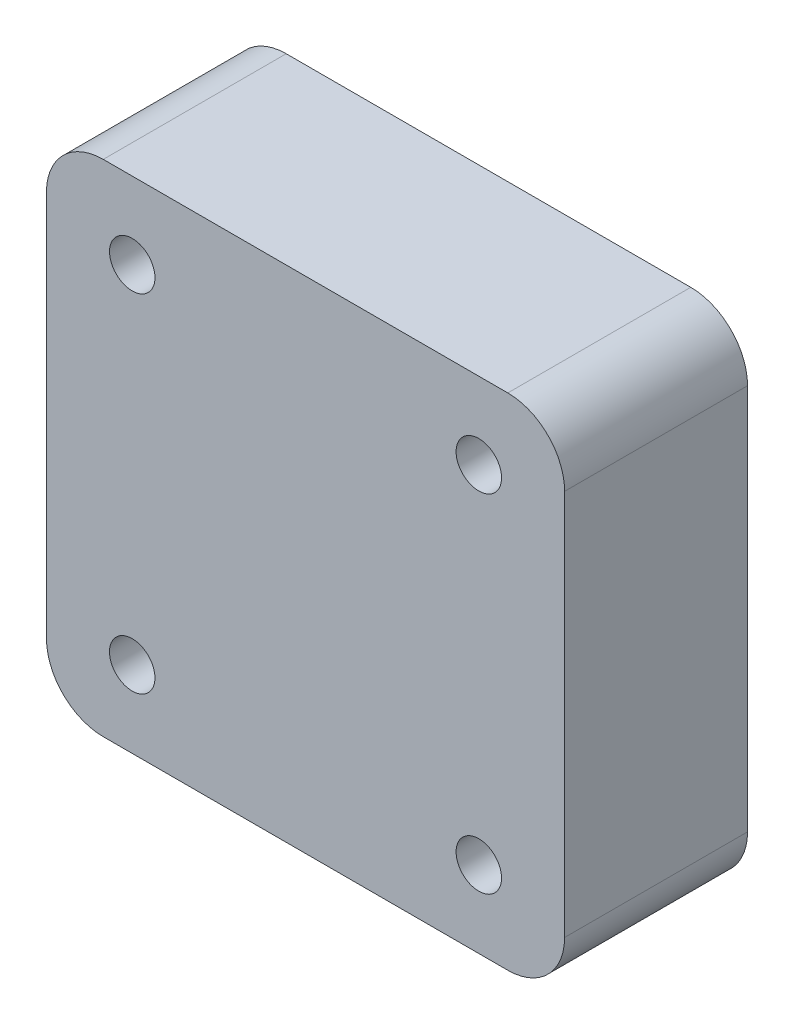
ISO-10303-21;
HEADER;
FILE_DESCRIPTION(('STEP AP214'),'2;1');
FILE_NAME('part.step','',(''),(''),'','','');
FILE_SCHEMA(('AUTOMOTIVE_DESIGN { 1 0 10303 214 1 1 1 1 }'));
ENDSEC;
DATA;
#1=APPLICATION_CONTEXT('core data for automotive mechanical design processes');
#2=APPLICATION_PROTOCOL_DEFINITION('international standard','automotive_design',2000,#1);
#3=PRODUCT_CONTEXT('',#1,'mechanical');
#4=PRODUCT('Part','Part','',(#3));
#5=PRODUCT_RELATED_PRODUCT_CATEGORY('part','',(#4));
#6=PRODUCT_DEFINITION_FORMATION('','',#4);
#7=PRODUCT_DEFINITION_CONTEXT('part definition',#1,'design');
#8=PRODUCT_DEFINITION('design','',#6,#7);
#9=PRODUCT_DEFINITION_SHAPE('','',#8);
#10=(LENGTH_UNIT() NAMED_UNIT(*) SI_UNIT(.MILLI.,.METRE.));
#11=(NAMED_UNIT(*) PLANE_ANGLE_UNIT() SI_UNIT($,.RADIAN.));
#12=(NAMED_UNIT(*) SI_UNIT($,.STERADIAN.) SOLID_ANGLE_UNIT());
#13=UNCERTAINTY_MEASURE_WITH_UNIT(LENGTH_MEASURE(1.E-05),#10,'distance_accuracy_value','');
#14=(GEOMETRIC_REPRESENTATION_CONTEXT(3) GLOBAL_UNCERTAINTY_ASSIGNED_CONTEXT((#13)) GLOBAL_UNIT_ASSIGNED_CONTEXT((#10,
#11,#12)) REPRESENTATION_CONTEXT('',''));
#15=CARTESIAN_POINT('',(0.,0.,0.));
#16=DIRECTION('',(0.,0.,1.));
#17=DIRECTION('',(1.,0.,0.));
#18=AXIS2_PLACEMENT_3D('',#15,#16,#17);
#19=CARTESIAN_POINT('',(17.8,-17.,16.1));
#20=DIRECTION('',(0.,0.,1.));
#21=DIRECTION('',(1.,0.,0.));
#22=AXIS2_PLACEMENT_3D('',#19,#20,#21);
#23=PLANE('',#22);
#24=CARTESIAN_POINT('',(15.25,-15.25,16.1));
#25=DIRECTION('',(0.,0.,1.));
#26=DIRECTION('',(1.,0.,0.));
#27=AXIS2_PLACEMENT_3D('',#24,#25,#26);
#28=CIRCLE('',#27,2.);
#29=CARTESIAN_POINT('',(17.25,-15.25,16.1));
#30=VERTEX_POINT('',#29);
#31=EDGE_CURVE('E194',#30,#30,#28,.T.);
#32=ORIENTED_EDGE('',*,*,#31,.F.);
#33=EDGE_LOOP('',(#32));
#34=FACE_BOUND('',#33,.T.);
#35=CARTESIAN_POINT('',(-15.25,15.25,16.1));
#36=DIRECTION('',(0.,0.,1.));
#37=DIRECTION('',(1.,0.,0.));
#38=AXIS2_PLACEMENT_3D('',#35,#36,#37);
#39=CIRCLE('',#38,2.);
#40=CARTESIAN_POINT('',(-13.25,15.25,16.1));
#41=VERTEX_POINT('',#40);
#42=EDGE_CURVE('E140',#41,#41,#39,.T.);
#43=ORIENTED_EDGE('',*,*,#42,.F.);
#44=EDGE_LOOP('',(#43));
#45=FACE_BOUND('',#44,.T.);
#46=CARTESIAN_POINT('',(17.8,-17.,16.1));
#47=DIRECTION('',(0.,0.,1.));
#48=DIRECTION('',(1.,0.,0.));
#49=AXIS2_PLACEMENT_3D('',#46,#47,#48);
#50=CIRCLE('',#49,5.);
#51=CARTESIAN_POINT('',(17.8,-22.,16.1));
#52=VERTEX_POINT('',#51);
#53=CARTESIAN_POINT('',(22.8,-17.,16.1));
#54=VERTEX_POINT('',#53);
#55=EDGE_CURVE('E151',#52,#54,#50,.T.);
#56=ORIENTED_EDGE('',*,*,#55,.T.);
#57=DIRECTION('',(0.,1.,0.));
#58=VECTOR('',#57,1.);
#59=CARTESIAN_POINT('',(22.8,-17.,16.1));
#60=LINE('',#59,#58);
#61=CARTESIAN_POINT('',(22.8,17.,16.1));
#62=VERTEX_POINT('',#61);
#63=EDGE_CURVE('E99',#54,#62,#60,.T.);
#64=ORIENTED_EDGE('',*,*,#63,.T.);
#65=CARTESIAN_POINT('',(17.8,17.,16.1));
#66=DIRECTION('',(0.,0.,1.));
#67=DIRECTION('',(-1.,0.,0.));
#68=AXIS2_PLACEMENT_3D('',#65,#66,#67);
#69=CIRCLE('',#68,5.);
#70=CARTESIAN_POINT('',(17.8,22.,16.1));
#71=VERTEX_POINT('',#70);
#72=EDGE_CURVE('E166',#62,#71,#69,.T.);
#73=ORIENTED_EDGE('',*,*,#72,.T.);
#74=DIRECTION('',(-1.,0.,0.));
#75=VECTOR('',#74,1.);
#76=CARTESIAN_POINT('',(-17.8,22.,16.1));
#77=LINE('',#76,#75);
#78=CARTESIAN_POINT('',(-17.8,22.,16.1));
#79=VERTEX_POINT('',#78);
#80=EDGE_CURVE('E179',#71,#79,#77,.T.);
#81=ORIENTED_EDGE('',*,*,#80,.T.);
#82=CARTESIAN_POINT('',(-17.8,17.,16.1));
#83=DIRECTION('',(0.,0.,1.));
#84=DIRECTION('',(-1.,0.,0.));
#85=AXIS2_PLACEMENT_3D('',#82,#83,#84);
#86=CIRCLE('',#85,5.);
#87=CARTESIAN_POINT('',(-22.8,17.,16.1));
#88=VERTEX_POINT('',#87);
#89=EDGE_CURVE('E118',#79,#88,#86,.T.);
#90=ORIENTED_EDGE('',*,*,#89,.T.);
#91=DIRECTION('',(0.,-1.,0.));
#92=VECTOR('',#91,1.);
#93=CARTESIAN_POINT('',(-22.8,-17.,16.1));
#94=LINE('',#93,#92);
#95=CARTESIAN_POINT('',(-22.8,-17.,16.1));
#96=VERTEX_POINT('',#95);
#97=EDGE_CURVE('E112',#88,#96,#94,.T.);
#98=ORIENTED_EDGE('',*,*,#97,.T.);
#99=CARTESIAN_POINT('',(-17.8,-17.,16.1));
#100=DIRECTION('',(0.,0.,1.));
#101=DIRECTION('',(-1.,0.,0.));
#102=AXIS2_PLACEMENT_3D('',#99,#100,#101);
#103=CIRCLE('',#102,5.);
#104=CARTESIAN_POINT('',(-17.8,-22.,16.1));
#105=VERTEX_POINT('',#104);
#106=EDGE_CURVE('E116',#96,#105,#103,.T.);
#107=ORIENTED_EDGE('',*,*,#106,.T.);
#108=DIRECTION('',(1.,0.,0.));
#109=VECTOR('',#108,1.);
#110=CARTESIAN_POINT('',(-17.8,-22.,16.1));
#111=LINE('',#110,#109);
#112=EDGE_CURVE('E56',#105,#52,#111,.T.);
#113=ORIENTED_EDGE('',*,*,#112,.T.);
#114=EDGE_LOOP('',(#56,#64,#73,#81,#90,#98,#107,#113));
#115=FACE_BOUND('',#114,.T.);
#116=CARTESIAN_POINT('',(15.25,15.25,16.1));
#117=DIRECTION('',(0.,0.,1.));
#118=DIRECTION('',(-1.,0.,0.));
#119=AXIS2_PLACEMENT_3D('',#116,#117,#118);
#120=CIRCLE('',#119,2.);
#121=CARTESIAN_POINT('',(13.25,15.25,16.1));
#122=VERTEX_POINT('',#121);
#123=EDGE_CURVE('E188',#122,#122,#120,.T.);
#124=ORIENTED_EDGE('',*,*,#123,.F.);
#125=EDGE_LOOP('',(#124));
#126=FACE_BOUND('',#125,.T.);
#127=CARTESIAN_POINT('',(-15.25,-15.25,16.1));
#128=DIRECTION('',(0.,0.,1.));
#129=DIRECTION('',(-1.,0.,0.));
#130=AXIS2_PLACEMENT_3D('',#127,#128,#129);
#131=CIRCLE('',#130,2.);
#132=CARTESIAN_POINT('',(-17.25,-15.25,16.1));
#133=VERTEX_POINT('',#132);
#134=EDGE_CURVE('E200',#133,#133,#131,.T.);
#135=ORIENTED_EDGE('',*,*,#134,.F.);
#136=EDGE_LOOP('',(#135));
#137=FACE_BOUND('',#136,.T.);
#138=ADVANCED_FACE('F39',(#34,#45,#115,#126,#137),#23,.T.);
#139=CARTESIAN_POINT('',(17.8,-17.,0.));
#140=DIRECTION('',(0.,0.,1.));
#141=DIRECTION('',(1.,0.,0.));
#142=AXIS2_PLACEMENT_3D('',#139,#140,#141);
#143=PLANE('',#142);
#144=CARTESIAN_POINT('',(17.8,-17.,0.));
#145=DIRECTION('',(0.,0.,1.));
#146=DIRECTION('',(1.,0.,0.));
#147=AXIS2_PLACEMENT_3D('',#144,#145,#146);
#148=CIRCLE('',#147,5.);
#149=CARTESIAN_POINT('',(17.8,-22.,0.));
#150=VERTEX_POINT('',#149);
#151=CARTESIAN_POINT('',(22.8,-17.,0.));
#152=VERTEX_POINT('',#151);
#153=EDGE_CURVE('E136',#150,#152,#148,.T.);
#154=ORIENTED_EDGE('',*,*,#153,.F.);
#155=DIRECTION('',(1.,0.,0.));
#156=VECTOR('',#155,1.);
#157=CARTESIAN_POINT('',(-17.8,-22.,0.));
#158=LINE('',#157,#156);
#159=CARTESIAN_POINT('',(-17.8,-22.,0.));
#160=VERTEX_POINT('',#159);
#161=EDGE_CURVE('E91',#160,#150,#158,.T.);
#162=ORIENTED_EDGE('',*,*,#161,.F.);
#163=CARTESIAN_POINT('',(-17.8,-17.,0.));
#164=DIRECTION('',(0.,0.,1.));
#165=DIRECTION('',(-1.,0.,0.));
#166=AXIS2_PLACEMENT_3D('',#163,#164,#165);
#167=CIRCLE('',#166,5.);
#168=CARTESIAN_POINT('',(-22.8,-17.,0.));
#169=VERTEX_POINT('',#168);
#170=EDGE_CURVE('E85',#169,#160,#167,.T.);
#171=ORIENTED_EDGE('',*,*,#170,.F.);
#172=DIRECTION('',(0.,-1.,0.));
#173=VECTOR('',#172,1.);
#174=CARTESIAN_POINT('',(-22.8,-17.,0.));
#175=LINE('',#174,#173);
#176=CARTESIAN_POINT('',(-22.8,17.,0.));
#177=VERTEX_POINT('',#176);
#178=EDGE_CURVE('E126',#177,#169,#175,.T.);
#179=ORIENTED_EDGE('',*,*,#178,.F.);
#180=CARTESIAN_POINT('',(-17.8,17.,0.));
#181=DIRECTION('',(0.,0.,1.));
#182=DIRECTION('',(-1.,0.,0.));
#183=AXIS2_PLACEMENT_3D('',#180,#181,#182);
#184=CIRCLE('',#183,5.);
#185=CARTESIAN_POINT('',(-17.8,22.,0.));
#186=VERTEX_POINT('',#185);
#187=EDGE_CURVE('E146',#186,#177,#184,.T.);
#188=ORIENTED_EDGE('',*,*,#187,.F.);
#189=DIRECTION('',(-1.,0.,0.));
#190=VECTOR('',#189,1.);
#191=CARTESIAN_POINT('',(-17.8,22.,0.));
#192=LINE('',#191,#190);
#193=CARTESIAN_POINT('',(17.8,22.,0.));
#194=VERTEX_POINT('',#193);
#195=EDGE_CURVE('E144',#194,#186,#192,.T.);
#196=ORIENTED_EDGE('',*,*,#195,.F.);
#197=CARTESIAN_POINT('',(17.8,17.,0.));
#198=DIRECTION('',(0.,0.,1.));
#199=DIRECTION('',(-1.,0.,0.));
#200=AXIS2_PLACEMENT_3D('',#197,#198,#199);
#201=CIRCLE('',#200,5.);
#202=CARTESIAN_POINT('',(22.8,17.,0.));
#203=VERTEX_POINT('',#202);
#204=EDGE_CURVE('E142',#203,#194,#201,.T.);
#205=ORIENTED_EDGE('',*,*,#204,.F.);
#206=DIRECTION('',(0.,1.,0.));
#207=VECTOR('',#206,1.);
#208=CARTESIAN_POINT('',(22.8,-17.,0.));
#209=LINE('',#208,#207);
#210=EDGE_CURVE('E139',#152,#203,#209,.T.);
#211=ORIENTED_EDGE('',*,*,#210,.F.);
#212=EDGE_LOOP('',(#154,#162,#171,#179,#188,#196,#205,#211));
#213=FACE_BOUND('',#212,.T.);
#214=CARTESIAN_POINT('',(-15.25,15.25,0.));
#215=DIRECTION('',(0.,0.,1.));
#216=DIRECTION('',(1.,0.,0.));
#217=AXIS2_PLACEMENT_3D('',#214,#215,#216);
#218=CIRCLE('',#217,2.);
#219=CARTESIAN_POINT('',(-13.25,15.25,0.));
#220=VERTEX_POINT('',#219);
#221=EDGE_CURVE('E185',#220,#220,#218,.T.);
#222=ORIENTED_EDGE('',*,*,#221,.T.);
#223=EDGE_LOOP('',(#222));
#224=FACE_BOUND('',#223,.T.);
#225=CARTESIAN_POINT('',(15.25,15.25,0.));
#226=DIRECTION('',(0.,0.,1.));
#227=DIRECTION('',(-1.,0.,0.));
#228=AXIS2_PLACEMENT_3D('',#225,#226,#227);
#229=CIRCLE('',#228,2.);
#230=CARTESIAN_POINT('',(13.25,15.25,0.));
#231=VERTEX_POINT('',#230);
#232=EDGE_CURVE('E191',#231,#231,#229,.T.);
#233=ORIENTED_EDGE('',*,*,#232,.T.);
#234=EDGE_LOOP('',(#233));
#235=FACE_BOUND('',#234,.T.);
#236=CARTESIAN_POINT('',(15.25,-15.25,0.));
#237=DIRECTION('',(0.,0.,1.));
#238=DIRECTION('',(1.,0.,0.));
#239=AXIS2_PLACEMENT_3D('',#236,#237,#238);
#240=CIRCLE('',#239,2.);
#241=CARTESIAN_POINT('',(17.25,-15.25,0.));
#242=VERTEX_POINT('',#241);
#243=EDGE_CURVE('E197',#242,#242,#240,.T.);
#244=ORIENTED_EDGE('',*,*,#243,.T.);
#245=EDGE_LOOP('',(#244));
#246=FACE_BOUND('',#245,.T.);
#247=CARTESIAN_POINT('',(-15.25,-15.25,0.));
#248=DIRECTION('',(0.,0.,1.));
#249=DIRECTION('',(-1.,0.,0.));
#250=AXIS2_PLACEMENT_3D('',#247,#248,#249);
#251=CIRCLE('',#250,2.);
#252=CARTESIAN_POINT('',(-17.25,-15.25,0.));
#253=VERTEX_POINT('',#252);
#254=EDGE_CURVE('E203',#253,#253,#251,.T.);
#255=ORIENTED_EDGE('',*,*,#254,.T.);
#256=EDGE_LOOP('',(#255));
#257=FACE_BOUND('',#256,.T.);
#258=ADVANCED_FACE('F170',(#213,#224,#235,#246,#257),#143,.F.);
#259=CARTESIAN_POINT('',(17.8,-17.,16.1));
#260=DIRECTION('',(0.,0.,-1.));
#261=DIRECTION('',(-1.,0.,0.));
#262=AXIS2_PLACEMENT_3D('',#259,#260,#261);
#263=CYLINDRICAL_SURFACE('',#262,5.);
#264=ORIENTED_EDGE('',*,*,#153,.T.);
#265=DIRECTION('',(0.,0.,-1.));
#266=VECTOR('',#265,1.);
#267=CARTESIAN_POINT('',(22.8,-17.,16.1));
#268=LINE('',#267,#266);
#269=EDGE_CURVE('E11',#54,#152,#268,.T.);
#270=ORIENTED_EDGE('',*,*,#269,.F.);
#271=ORIENTED_EDGE('',*,*,#55,.F.);
#272=DIRECTION('',(0.,0.,-1.));
#273=VECTOR('',#272,1.);
#274=CARTESIAN_POINT('',(17.8,-22.,16.1));
#275=LINE('',#274,#273);
#276=EDGE_CURVE('E132',#52,#150,#275,.T.);
#277=ORIENTED_EDGE('',*,*,#276,.T.);
#278=EDGE_LOOP('',(#264,#270,#271,#277));
#279=FACE_BOUND('',#278,.T.);
#280=ADVANCED_FACE('F41',(#279),#263,.T.);
#281=CARTESIAN_POINT('',(22.8,-17.,16.1));
#282=DIRECTION('',(-1.,0.,0.));
#283=DIRECTION('',(0.,0.,1.));
#284=AXIS2_PLACEMENT_3D('',#281,#282,#283);
#285=PLANE('',#284);
#286=ORIENTED_EDGE('',*,*,#210,.T.);
#287=DIRECTION('',(0.,0.,-1.));
#288=VECTOR('',#287,1.);
#289=CARTESIAN_POINT('',(22.8,17.,16.1));
#290=LINE('',#289,#288);
#291=EDGE_CURVE('E48',#62,#203,#290,.T.);
#292=ORIENTED_EDGE('',*,*,#291,.F.);
#293=ORIENTED_EDGE('',*,*,#63,.F.);
#294=ORIENTED_EDGE('',*,*,#269,.T.);
#295=EDGE_LOOP('',(#286,#292,#293,#294));
#296=FACE_BOUND('',#295,.T.);
#297=ADVANCED_FACE('F237',(#296),#285,.F.);
#298=CARTESIAN_POINT('',(17.8,17.,16.1));
#299=DIRECTION('',(0.,0.,-1.));
#300=DIRECTION('',(-1.,0.,0.));
#301=AXIS2_PLACEMENT_3D('',#298,#299,#300);
#302=CYLINDRICAL_SURFACE('',#301,5.);
#303=ORIENTED_EDGE('',*,*,#204,.T.);
#304=DIRECTION('',(0.,0.,-1.));
#305=VECTOR('',#304,1.);
#306=CARTESIAN_POINT('',(17.8,22.,16.1));
#307=LINE('',#306,#305);
#308=EDGE_CURVE('E158',#71,#194,#307,.T.);
#309=ORIENTED_EDGE('',*,*,#308,.F.);
#310=ORIENTED_EDGE('',*,*,#72,.F.);
#311=ORIENTED_EDGE('',*,*,#291,.T.);
#312=EDGE_LOOP('',(#303,#309,#310,#311));
#313=FACE_BOUND('',#312,.T.);
#314=ADVANCED_FACE('F164',(#313),#302,.T.);
#315=CARTESIAN_POINT('',(-17.8,22.,16.1));
#316=DIRECTION('',(0.,-1.,0.));
#317=DIRECTION('',(0.,0.,-1.));
#318=AXIS2_PLACEMENT_3D('',#315,#316,#317);
#319=PLANE('',#318);
#320=ORIENTED_EDGE('',*,*,#195,.T.);
#321=DIRECTION('',(0.,0.,-1.));
#322=VECTOR('',#321,1.);
#323=CARTESIAN_POINT('',(-17.8,22.,16.1));
#324=LINE('',#323,#322);
#325=EDGE_CURVE('E155',#79,#186,#324,.T.);
#326=ORIENTED_EDGE('',*,*,#325,.F.);
#327=ORIENTED_EDGE('',*,*,#80,.F.);
#328=ORIENTED_EDGE('',*,*,#308,.T.);
#329=EDGE_LOOP('',(#320,#326,#327,#328));
#330=FACE_BOUND('',#329,.T.);
#331=ADVANCED_FACE('F175',(#330),#319,.F.);
#332=CARTESIAN_POINT('',(-17.8,17.,16.1));
#333=DIRECTION('',(0.,0.,-1.));
#334=DIRECTION('',(-1.,0.,0.));
#335=AXIS2_PLACEMENT_3D('',#332,#333,#334);
#336=CYLINDRICAL_SURFACE('',#335,5.);
#337=ORIENTED_EDGE('',*,*,#187,.T.);
#338=DIRECTION('',(0.,0.,-1.));
#339=VECTOR('',#338,1.);
#340=CARTESIAN_POINT('',(-22.8,17.,16.1));
#341=LINE('',#340,#339);
#342=EDGE_CURVE('E127',#88,#177,#341,.T.);
#343=ORIENTED_EDGE('',*,*,#342,.F.);
#344=ORIENTED_EDGE('',*,*,#89,.F.);
#345=ORIENTED_EDGE('',*,*,#325,.T.);
#346=EDGE_LOOP('',(#337,#343,#344,#345));
#347=FACE_BOUND('',#346,.T.);
#348=ADVANCED_FACE('F178',(#347),#336,.T.);
#349=CARTESIAN_POINT('',(-22.8,-17.,16.1));
#350=DIRECTION('',(1.,0.,0.));
#351=DIRECTION('',(0.,0.,-1.));
#352=AXIS2_PLACEMENT_3D('',#349,#350,#351);
#353=PLANE('',#352);
#354=ORIENTED_EDGE('',*,*,#178,.T.);
#355=DIRECTION('',(0.,0.,-1.));
#356=VECTOR('',#355,1.);
#357=CARTESIAN_POINT('',(-22.8,-17.,16.1));
#358=LINE('',#357,#356);
#359=EDGE_CURVE('E123',#96,#169,#358,.T.);
#360=ORIENTED_EDGE('',*,*,#359,.F.);
#361=ORIENTED_EDGE('',*,*,#97,.F.);
#362=ORIENTED_EDGE('',*,*,#342,.T.);
#363=EDGE_LOOP('',(#354,#360,#361,#362));
#364=FACE_BOUND('',#363,.T.);
#365=ADVANCED_FACE('F124',(#364),#353,.F.);
#366=CARTESIAN_POINT('',(-17.8,-17.,16.1));
#367=DIRECTION('',(0.,0.,-1.));
#368=DIRECTION('',(-1.,0.,0.));
#369=AXIS2_PLACEMENT_3D('',#366,#367,#368);
#370=CYLINDRICAL_SURFACE('',#369,5.);
#371=ORIENTED_EDGE('',*,*,#170,.T.);
#372=DIRECTION('',(0.,0.,-1.));
#373=VECTOR('',#372,1.);
#374=CARTESIAN_POINT('',(-17.8,-22.,16.1));
#375=LINE('',#374,#373);
#376=EDGE_CURVE('E128',#105,#160,#375,.T.);
#377=ORIENTED_EDGE('',*,*,#376,.F.);
#378=ORIENTED_EDGE('',*,*,#106,.F.);
#379=ORIENTED_EDGE('',*,*,#359,.T.);
#380=EDGE_LOOP('',(#371,#377,#378,#379));
#381=FACE_BOUND('',#380,.T.);
#382=ADVANCED_FACE('F130',(#381),#370,.T.);
#383=CARTESIAN_POINT('',(-17.8,-22.,16.1));
#384=DIRECTION('',(0.,1.,0.));
#385=DIRECTION('',(0.,0.,1.));
#386=AXIS2_PLACEMENT_3D('',#383,#384,#385);
#387=PLANE('',#386);
#388=ORIENTED_EDGE('',*,*,#161,.T.);
#389=ORIENTED_EDGE('',*,*,#276,.F.);
#390=ORIENTED_EDGE('',*,*,#112,.F.);
#391=ORIENTED_EDGE('',*,*,#376,.T.);
#392=EDGE_LOOP('',(#388,#389,#390,#391));
#393=FACE_BOUND('',#392,.T.);
#394=ADVANCED_FACE('F225',(#393),#387,.F.);
#395=CARTESIAN_POINT('',(-15.25,15.25,16.1));
#396=DIRECTION('',(0.,0.,-1.));
#397=DIRECTION('',(-1.,0.,0.));
#398=AXIS2_PLACEMENT_3D('',#395,#396,#397);
#399=CYLINDRICAL_SURFACE('',#398,2.);
#400=ORIENTED_EDGE('',*,*,#42,.T.);
#401=EDGE_LOOP('',(#400));
#402=FACE_BOUND('',#401,.T.);
#403=ORIENTED_EDGE('',*,*,#221,.F.);
#404=EDGE_LOOP('',(#403));
#405=FACE_BOUND('',#404,.T.);
#406=ADVANCED_FACE('F222',(#402,#405),#399,.F.);
#407=CARTESIAN_POINT('',(15.25,15.25,16.1));
#408=DIRECTION('',(0.,0.,-1.));
#409=DIRECTION('',(-1.,0.,0.));
#410=AXIS2_PLACEMENT_3D('',#407,#408,#409);
#411=CYLINDRICAL_SURFACE('',#410,2.);
#412=ORIENTED_EDGE('',*,*,#123,.T.);
#413=EDGE_LOOP('',(#412));
#414=FACE_BOUND('',#413,.T.);
#415=ORIENTED_EDGE('',*,*,#232,.F.);
#416=EDGE_LOOP('',(#415));
#417=FACE_BOUND('',#416,.T.);
#418=ADVANCED_FACE('F300',(#414,#417),#411,.F.);
#419=CARTESIAN_POINT('',(15.25,-15.25,16.1));
#420=DIRECTION('',(0.,0.,-1.));
#421=DIRECTION('',(-1.,0.,0.));
#422=AXIS2_PLACEMENT_3D('',#419,#420,#421);
#423=CYLINDRICAL_SURFACE('',#422,2.);
#424=ORIENTED_EDGE('',*,*,#31,.T.);
#425=EDGE_LOOP('',(#424));
#426=FACE_BOUND('',#425,.T.);
#427=ORIENTED_EDGE('',*,*,#243,.F.);
#428=EDGE_LOOP('',(#427));
#429=FACE_BOUND('',#428,.T.);
#430=ADVANCED_FACE('F308',(#426,#429),#423,.F.);
#431=CARTESIAN_POINT('',(-15.25,-15.25,16.1));
#432=DIRECTION('',(0.,0.,-1.));
#433=DIRECTION('',(-1.,0.,0.));
#434=AXIS2_PLACEMENT_3D('',#431,#432,#433);
#435=CYLINDRICAL_SURFACE('',#434,2.);
#436=ORIENTED_EDGE('',*,*,#134,.T.);
#437=EDGE_LOOP('',(#436));
#438=FACE_BOUND('',#437,.T.);
#439=ORIENTED_EDGE('',*,*,#254,.F.);
#440=EDGE_LOOP('',(#439));
#441=FACE_BOUND('',#440,.T.);
#442=ADVANCED_FACE('F209',(#438,#441),#435,.F.);
#443=CLOSED_SHELL('',(#138,#258,#280,#297,#314,#331,#348,#365,#382,#394,#406,#418,#430,#442));
#444=MANIFOLD_SOLID_BREP('B2',#443);
#445=ADVANCED_BREP_SHAPE_REPRESENTATION('',(#18,#444),#14);
#446=SHAPE_DEFINITION_REPRESENTATION(#9,#445);
ENDSEC;
END-ISO-10303-21;
